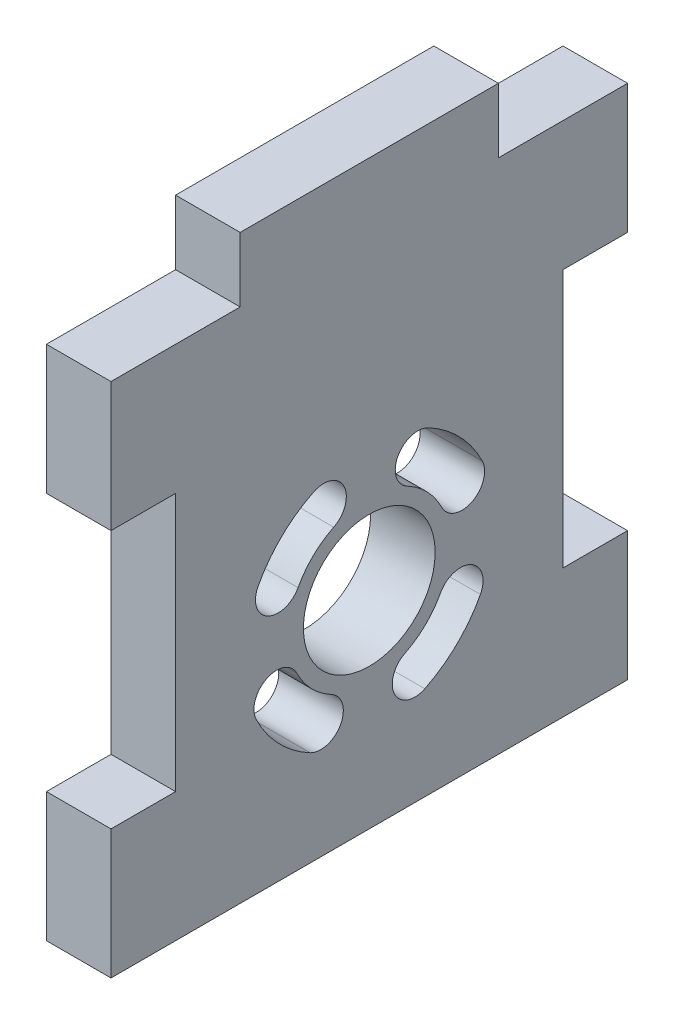
ISO-10303-21;
HEADER;
FILE_DESCRIPTION(('STEP AP214'),'2;1');
FILE_NAME('part.step','',(''),(''),'','','');
FILE_SCHEMA(('AUTOMOTIVE_DESIGN { 1 0 10303 214 1 1 1 1 }'));
ENDSEC;
DATA;
#1=APPLICATION_CONTEXT('core data for automotive mechanical design processes');
#2=APPLICATION_PROTOCOL_DEFINITION('international standard','automotive_design',2000,#1);
#3=PRODUCT_CONTEXT('',#1,'mechanical');
#4=PRODUCT('Part','Part','',(#3));
#5=PRODUCT_RELATED_PRODUCT_CATEGORY('part','',(#4));
#6=PRODUCT_DEFINITION_FORMATION('','',#4);
#7=PRODUCT_DEFINITION_CONTEXT('part definition',#1,'design');
#8=PRODUCT_DEFINITION('design','',#6,#7);
#9=PRODUCT_DEFINITION_SHAPE('','',#8);
#10=(LENGTH_UNIT() NAMED_UNIT(*) SI_UNIT(.MILLI.,.METRE.));
#11=(NAMED_UNIT(*) PLANE_ANGLE_UNIT() SI_UNIT($,.RADIAN.));
#12=(NAMED_UNIT(*) SI_UNIT($,.STERADIAN.) SOLID_ANGLE_UNIT());
#13=UNCERTAINTY_MEASURE_WITH_UNIT(LENGTH_MEASURE(1.E-05),#10,'distance_accuracy_value','');
#14=(GEOMETRIC_REPRESENTATION_CONTEXT(3) GLOBAL_UNCERTAINTY_ASSIGNED_CONTEXT((#13)) GLOBAL_UNIT_ASSIGNED_CONTEXT((#10,
#11,#12)) REPRESENTATION_CONTEXT('',''));
#15=CARTESIAN_POINT('',(0.,0.,0.));
#16=DIRECTION('',(0.,0.,1.));
#17=DIRECTION('',(1.,0.,0.));
#18=AXIS2_PLACEMENT_3D('',#15,#16,#17);
#19=CARTESIAN_POINT('',(5.,0.,0.));
#20=DIRECTION('',(1.,0.,0.));
#21=DIRECTION('',(0.,0.,-1.));
#22=AXIS2_PLACEMENT_3D('',#19,#20,#21);
#23=PLANE('',#22);
#24=DIRECTION('',(0.,1.,0.));
#25=VECTOR('',#24,1.);
#26=CARTESIAN_POINT('',(5.,0.,0.));
#27=LINE('',#26,#25);
#28=CARTESIAN_POINT('',(5.,0.,0.));
#29=VERTEX_POINT('',#28);
#30=CARTESIAN_POINT('',(5.,10.,0.));
#31=VERTEX_POINT('',#30);
#32=EDGE_CURVE('E378',#29,#31,#27,.T.);
#33=ORIENTED_EDGE('',*,*,#32,.T.);
#34=DIRECTION('',(0.,0.,1.));
#35=VECTOR('',#34,1.);
#36=CARTESIAN_POINT('',(5.,10.,0.));
#37=LINE('',#36,#35);
#38=CARTESIAN_POINT('',(5.,10.,5.));
#39=VERTEX_POINT('',#38);
#40=EDGE_CURVE('E381',#31,#39,#37,.T.);
#41=ORIENTED_EDGE('',*,*,#40,.T.);
#42=DIRECTION('',(0.,1.,0.));
#43=VECTOR('',#42,1.);
#44=CARTESIAN_POINT('',(5.,30.,5.));
#45=LINE('',#44,#43);
#46=CARTESIAN_POINT('',(5.,30.,5.));
#47=VERTEX_POINT('',#46);
#48=EDGE_CURVE('E384',#39,#47,#45,.T.);
#49=ORIENTED_EDGE('',*,*,#48,.T.);
#50=DIRECTION('',(0.,0.,-1.));
#51=VECTOR('',#50,1.);
#52=CARTESIAN_POINT('',(5.,30.,0.));
#53=LINE('',#52,#51);
#54=CARTESIAN_POINT('',(5.,30.,0.));
#55=VERTEX_POINT('',#54);
#56=EDGE_CURVE('E386',#47,#55,#53,.T.);
#57=ORIENTED_EDGE('',*,*,#56,.T.);
#58=DIRECTION('',(0.,1.,0.));
#59=VECTOR('',#58,1.);
#60=CARTESIAN_POINT('',(5.,30.,0.));
#61=LINE('',#60,#59);
#62=CARTESIAN_POINT('',(5.,40.,0.));
#63=VERTEX_POINT('',#62);
#64=EDGE_CURVE('E388',#55,#63,#61,.T.);
#65=ORIENTED_EDGE('',*,*,#64,.T.);
#66=DIRECTION('',(0.,0.,1.));
#67=VECTOR('',#66,1.);
#68=CARTESIAN_POINT('',(5.,40.,0.));
#69=LINE('',#68,#67);
#70=CARTESIAN_POINT('',(5.,40.,10.));
#71=VERTEX_POINT('',#70);
#72=EDGE_CURVE('E390',#63,#71,#69,.T.);
#73=ORIENTED_EDGE('',*,*,#72,.T.);
#74=DIRECTION('',(0.,1.,0.));
#75=VECTOR('',#74,1.);
#76=CARTESIAN_POINT('',(5.,40.,10.));
#77=LINE('',#76,#75);
#78=CARTESIAN_POINT('',(5.,45.,10.));
#79=VERTEX_POINT('',#78);
#80=EDGE_CURVE('E392',#71,#79,#77,.T.);
#81=ORIENTED_EDGE('',*,*,#80,.T.);
#82=DIRECTION('',(0.,0.,1.));
#83=VECTOR('',#82,1.);
#84=CARTESIAN_POINT('',(5.,45.,30.));
#85=LINE('',#84,#83);
#86=CARTESIAN_POINT('',(5.,45.,30.));
#87=VERTEX_POINT('',#86);
#88=EDGE_CURVE('E394',#79,#87,#85,.T.);
#89=ORIENTED_EDGE('',*,*,#88,.T.);
#90=DIRECTION('',(0.,-1.,0.));
#91=VECTOR('',#90,1.);
#92=CARTESIAN_POINT('',(5.,40.,30.));
#93=LINE('',#92,#91);
#94=CARTESIAN_POINT('',(5.,40.,30.));
#95=VERTEX_POINT('',#94);
#96=EDGE_CURVE('E396',#87,#95,#93,.T.);
#97=ORIENTED_EDGE('',*,*,#96,.T.);
#98=DIRECTION('',(0.,0.,1.));
#99=VECTOR('',#98,1.);
#100=CARTESIAN_POINT('',(5.,40.,30.));
#101=LINE('',#100,#99);
#102=CARTESIAN_POINT('',(5.,40.,40.));
#103=VERTEX_POINT('',#102);
#104=EDGE_CURVE('E398',#95,#103,#101,.T.);
#105=ORIENTED_EDGE('',*,*,#104,.T.);
#106=DIRECTION('',(0.,-1.,0.));
#107=VECTOR('',#106,1.);
#108=CARTESIAN_POINT('',(5.,30.,40.));
#109=LINE('',#108,#107);
#110=CARTESIAN_POINT('',(5.,30.,40.));
#111=VERTEX_POINT('',#110);
#112=EDGE_CURVE('E400',#103,#111,#109,.T.);
#113=ORIENTED_EDGE('',*,*,#112,.T.);
#114=DIRECTION('',(0.,0.,-1.));
#115=VECTOR('',#114,1.);
#116=CARTESIAN_POINT('',(5.,30.,40.));
#117=LINE('',#116,#115);
#118=CARTESIAN_POINT('',(5.,30.,35.));
#119=VERTEX_POINT('',#118);
#120=EDGE_CURVE('E402',#111,#119,#117,.T.);
#121=ORIENTED_EDGE('',*,*,#120,.T.);
#122=DIRECTION('',(0.,-1.,0.));
#123=VECTOR('',#122,1.);
#124=CARTESIAN_POINT('',(5.,30.,35.));
#125=LINE('',#124,#123);
#126=CARTESIAN_POINT('',(5.,9.99999999999999,35.));
#127=VERTEX_POINT('',#126);
#128=EDGE_CURVE('E404',#119,#127,#125,.T.);
#129=ORIENTED_EDGE('',*,*,#128,.T.);
#130=DIRECTION('',(0.,0.,1.));
#131=VECTOR('',#130,1.);
#132=CARTESIAN_POINT('',(5.,9.99999999999999,40.));
#133=LINE('',#132,#131);
#134=CARTESIAN_POINT('',(5.,9.99999999999999,40.));
#135=VERTEX_POINT('',#134);
#136=EDGE_CURVE('E406',#127,#135,#133,.T.);
#137=ORIENTED_EDGE('',*,*,#136,.T.);
#138=DIRECTION('',(0.,-1.,0.));
#139=VECTOR('',#138,1.);
#140=CARTESIAN_POINT('',(5.,0.,40.));
#141=LINE('',#140,#139);
#142=CARTESIAN_POINT('',(5.,0.,40.));
#143=VERTEX_POINT('',#142);
#144=EDGE_CURVE('E408',#135,#143,#141,.T.);
#145=ORIENTED_EDGE('',*,*,#144,.T.);
#146=DIRECTION('',(0.,0.,-1.));
#147=VECTOR('',#146,1.);
#148=CARTESIAN_POINT('',(5.,0.,0.));
#149=LINE('',#148,#147);
#150=EDGE_CURVE('E410',#143,#29,#149,.T.);
#151=ORIENTED_EDGE('',*,*,#150,.T.);
#152=EDGE_LOOP('',(#33,#41,#49,#57,#65,#73,#81,#89,#97,#105,#113,#121,#129,#137,#145,#151));
#153=FACE_BOUND('',#152,.T.);
#154=CARTESIAN_POINT('',(5.,16.,20.));
#155=DIRECTION('',(1.,0.,0.));
#156=DIRECTION('',(0.,0.,-1.));
#157=AXIS2_PLACEMENT_3D('',#154,#155,#156);
#158=CIRCLE('',#157,5.1);
#159=CARTESIAN_POINT('',(5.,16.,14.9));
#160=VERTEX_POINT('',#159);
#161=EDGE_CURVE('E372',#160,#160,#158,.T.);
#162=ORIENTED_EDGE('',*,*,#161,.F.);
#163=EDGE_LOOP('',(#162));
#164=FACE_BOUND('',#163,.T.);
#165=CARTESIAN_POINT('',(5.,16.,20.));
#166=DIRECTION('',(1.,0.,0.));
#167=DIRECTION('',(0.,0.,-1.));
#168=AXIS2_PLACEMENT_3D('',#165,#166,#167);
#169=CIRCLE('',#168,9.75);
#170=CARTESIAN_POINT('',(5.,24.7512638042438,24.2985906793428));
#171=VERTEX_POINT('',#170);
#172=CARTESIAN_POINT('',(5.,20.5818585103318,28.6063390934415));
#173=VERTEX_POINT('',#172);
#174=EDGE_CURVE('E343',#171,#173,#169,.T.);
#175=ORIENTED_EDGE('',*,*,#174,.F.);
#176=CARTESIAN_POINT('',(5.,23.1805241470718,23.5270487625377));
#177=DIRECTION('',(1.,0.,0.));
#178=DIRECTION('',(0.,0.,-1.));
#179=AXIS2_PLACEMENT_3D('',#176,#177,#178);
#180=CIRCLE('',#179,1.75);
#181=CARTESIAN_POINT('',(5.,21.6097844898999,22.7555068457326));
#182=VERTEX_POINT('',#181);
#183=EDGE_CURVE('E341',#182,#171,#180,.T.);
#184=ORIENTED_EDGE('',*,*,#183,.F.);
#185=CARTESIAN_POINT('',(5.,16.,20.));
#186=DIRECTION('',(-1.,0.,0.));
#187=DIRECTION('',(0.,0.,-1.));
#188=AXIS2_PLACEMENT_3D('',#185,#186,#187);
#189=CIRCLE('',#188,6.25);
#190=CARTESIAN_POINT('',(5.,18.9370887886742,25.5168840342574));
#191=VERTEX_POINT('',#190);
#192=EDGE_CURVE('E349',#191,#182,#189,.T.);
#193=ORIENTED_EDGE('',*,*,#192,.F.);
#194=CARTESIAN_POINT('',(5.,19.759473649503,27.0616115638495));
#195=DIRECTION('',(1.,0.,0.));
#196=DIRECTION('',(0.,0.,-1.));
#197=AXIS2_PLACEMENT_3D('',#194,#195,#196);
#198=CIRCLE('',#197,1.75);
#199=EDGE_CURVE('E346',#173,#191,#198,.T.);
#200=ORIENTED_EDGE('',*,*,#199,.F.);
#201=EDGE_LOOP('',(#175,#184,#193,#200));
#202=FACE_BOUND('',#201,.T.);
#203=CARTESIAN_POINT('',(5.,16.,20.));
#204=DIRECTION('',(1.,0.,0.));
#205=DIRECTION('',(0.,0.,-1.));
#206=AXIS2_PLACEMENT_3D('',#203,#204,#205);
#207=CIRCLE('',#206,9.74999999999999);
#208=CARTESIAN_POINT('',(5.,20.2985906793428,11.2487361957562));
#209=VERTEX_POINT('',#208);
#210=CARTESIAN_POINT('',(5.,24.6063390934415,15.4181414896682));
#211=VERTEX_POINT('',#210);
#212=EDGE_CURVE('E312',#209,#211,#207,.T.);
#213=ORIENTED_EDGE('',*,*,#212,.F.);
#214=CARTESIAN_POINT('',(5.,19.5270487625377,12.8194758529282));
#215=DIRECTION('',(1.,0.,0.));
#216=DIRECTION('',(0.,0.,-1.));
#217=AXIS2_PLACEMENT_3D('',#214,#215,#216);
#218=CIRCLE('',#217,1.75);
#219=CARTESIAN_POINT('',(5.,18.7555068457326,14.3902155101001));
#220=VERTEX_POINT('',#219);
#221=EDGE_CURVE('E310',#220,#209,#218,.T.);
#222=ORIENTED_EDGE('',*,*,#221,.F.);
#223=CARTESIAN_POINT('',(5.,16.,20.));
#224=DIRECTION('',(-1.,0.,0.));
#225=DIRECTION('',(0.,0.,-1.));
#226=AXIS2_PLACEMENT_3D('',#223,#224,#225);
#227=CIRCLE('',#226,6.25);
#228=CARTESIAN_POINT('',(5.,21.5168840342574,17.0629112113258));
#229=VERTEX_POINT('',#228);
#230=EDGE_CURVE('E318',#229,#220,#227,.T.);
#231=ORIENTED_EDGE('',*,*,#230,.F.);
#232=CARTESIAN_POINT('',(5.,23.0616115638495,16.240526350497));
#233=DIRECTION('',(1.,0.,0.));
#234=DIRECTION('',(0.,0.,-1.));
#235=AXIS2_PLACEMENT_3D('',#232,#233,#234);
#236=CIRCLE('',#235,1.74999999999999);
#237=EDGE_CURVE('E315',#211,#229,#236,.T.);
#238=ORIENTED_EDGE('',*,*,#237,.F.);
#239=EDGE_LOOP('',(#213,#222,#231,#238));
#240=FACE_BOUND('',#239,.T.);
#241=CARTESIAN_POINT('',(5.,16.,20.));
#242=DIRECTION('',(1.,0.,0.));
#243=DIRECTION('',(0.,0.,-1.));
#244=AXIS2_PLACEMENT_3D('',#241,#242,#243);
#245=CIRCLE('',#244,9.74999999999999);
#246=CARTESIAN_POINT('',(5.,7.24873619575623,15.7014093206572));
#247=VERTEX_POINT('',#246);
#248=CARTESIAN_POINT('',(5.,11.4181414896682,11.3936609065585));
#249=VERTEX_POINT('',#248);
#250=EDGE_CURVE('E281',#247,#249,#245,.T.);
#251=ORIENTED_EDGE('',*,*,#250,.F.);
#252=CARTESIAN_POINT('',(5.,8.81947585292819,16.4729512374623));
#253=DIRECTION('',(1.,0.,0.));
#254=DIRECTION('',(0.,0.,-1.));
#255=AXIS2_PLACEMENT_3D('',#252,#253,#254);
#256=CIRCLE('',#255,1.75);
#257=CARTESIAN_POINT('',(5.,10.3902155101001,17.2444931542674));
#258=VERTEX_POINT('',#257);
#259=EDGE_CURVE('E279',#258,#247,#256,.T.);
#260=ORIENTED_EDGE('',*,*,#259,.F.);
#261=CARTESIAN_POINT('',(5.,16.,20.));
#262=DIRECTION('',(-1.,0.,0.));
#263=DIRECTION('',(0.,0.,-1.));
#264=AXIS2_PLACEMENT_3D('',#261,#262,#263);
#265=CIRCLE('',#264,6.25);
#266=CARTESIAN_POINT('',(5.,13.0629112113258,14.4831159657426));
#267=VERTEX_POINT('',#266);
#268=EDGE_CURVE('E287',#267,#258,#265,.T.);
#269=ORIENTED_EDGE('',*,*,#268,.F.);
#270=CARTESIAN_POINT('',(5.,12.240526350497,12.9383884361505));
#271=DIRECTION('',(1.,0.,0.));
#272=DIRECTION('',(0.,0.,-1.));
#273=AXIS2_PLACEMENT_3D('',#270,#271,#272);
#274=CIRCLE('',#273,1.75);
#275=EDGE_CURVE('E284',#249,#267,#274,.T.);
#276=ORIENTED_EDGE('',*,*,#275,.F.);
#277=EDGE_LOOP('',(#251,#260,#269,#276));
#278=FACE_BOUND('',#277,.T.);
#279=CARTESIAN_POINT('',(5.,16.,20.));
#280=DIRECTION('',(1.,0.,0.));
#281=DIRECTION('',(0.,0.,-1.));
#282=AXIS2_PLACEMENT_3D('',#279,#280,#281);
#283=CIRCLE('',#282,9.75);
#284=CARTESIAN_POINT('',(5.,11.7014093206572,28.7512638042438));
#285=VERTEX_POINT('',#284);
#286=CARTESIAN_POINT('',(5.,7.39366090655847,24.5818585103318));
#287=VERTEX_POINT('',#286);
#288=EDGE_CURVE('E251',#285,#287,#283,.T.);
#289=ORIENTED_EDGE('',*,*,#288,.F.);
#290=CARTESIAN_POINT('',(5.,12.4729512374623,27.1805241470718));
#291=DIRECTION('',(1.,0.,0.));
#292=DIRECTION('',(0.,0.,-1.));
#293=AXIS2_PLACEMENT_3D('',#290,#291,#292);
#294=CIRCLE('',#293,1.75);
#295=CARTESIAN_POINT('',(5.,13.2444931542674,25.6097844898999));
#296=VERTEX_POINT('',#295);
#297=EDGE_CURVE('E243',#296,#285,#294,.T.);
#298=ORIENTED_EDGE('',*,*,#297,.F.);
#299=CARTESIAN_POINT('',(5.,16.,20.));
#300=DIRECTION('',(-1.,0.,0.));
#301=DIRECTION('',(0.,0.,-1.));
#302=AXIS2_PLACEMENT_3D('',#299,#300,#301);
#303=CIRCLE('',#302,6.25);
#304=CARTESIAN_POINT('',(5.,10.4831159657426,22.9370887886742));
#305=VERTEX_POINT('',#304);
#306=EDGE_CURVE('E265',#305,#296,#303,.T.);
#307=ORIENTED_EDGE('',*,*,#306,.F.);
#308=CARTESIAN_POINT('',(5.,8.93838843615054,23.759473649503));
#309=DIRECTION('',(1.,0.,0.));
#310=DIRECTION('',(0.,0.,-1.));
#311=AXIS2_PLACEMENT_3D('',#308,#309,#310);
#312=CIRCLE('',#311,1.75);
#313=EDGE_CURVE('E263',#287,#305,#312,.T.);
#314=ORIENTED_EDGE('',*,*,#313,.F.);
#315=EDGE_LOOP('',(#289,#298,#307,#314));
#316=FACE_BOUND('',#315,.T.);
#317=ADVANCED_FACE('F34',(#153,#164,#202,#240,#278,#316),#23,.T.);
#318=CARTESIAN_POINT('',(0.,0.,0.));
#319=DIRECTION('',(1.,0.,0.));
#320=DIRECTION('',(0.,0.,-1.));
#321=AXIS2_PLACEMENT_3D('',#318,#319,#320);
#322=PLANE('',#321);
#323=CARTESIAN_POINT('',(0.,8.81947585292819,16.4729512374623));
#324=DIRECTION('',(1.,0.,0.));
#325=DIRECTION('',(0.,0.,-1.));
#326=AXIS2_PLACEMENT_3D('',#323,#324,#325);
#327=CIRCLE('',#326,1.75);
#328=CARTESIAN_POINT('',(0.,10.3902155101001,17.2444931542674));
#329=VERTEX_POINT('',#328);
#330=CARTESIAN_POINT('',(0.,7.24873619575623,15.7014093206572));
#331=VERTEX_POINT('',#330);
#332=EDGE_CURVE('E259',#329,#331,#327,.T.);
#333=ORIENTED_EDGE('',*,*,#332,.T.);
#334=CARTESIAN_POINT('',(0.,16.,20.));
#335=DIRECTION('',(1.,0.,0.));
#336=DIRECTION('',(0.,0.,-1.));
#337=AXIS2_PLACEMENT_3D('',#334,#335,#336);
#338=CIRCLE('',#337,9.74999999999999);
#339=CARTESIAN_POINT('',(0.,11.4181414896682,11.3936609065585));
#340=VERTEX_POINT('',#339);
#341=EDGE_CURVE('E292',#331,#340,#338,.T.);
#342=ORIENTED_EDGE('',*,*,#341,.T.);
#343=CARTESIAN_POINT('',(0.,12.240526350497,12.9383884361505));
#344=DIRECTION('',(1.,0.,0.));
#345=DIRECTION('',(0.,0.,-1.));
#346=AXIS2_PLACEMENT_3D('',#343,#344,#345);
#347=CIRCLE('',#346,1.75);
#348=CARTESIAN_POINT('',(0.,13.0629112113258,14.4831159657426));
#349=VERTEX_POINT('',#348);
#350=EDGE_CURVE('E295',#340,#349,#347,.T.);
#351=ORIENTED_EDGE('',*,*,#350,.T.);
#352=CARTESIAN_POINT('',(0.,16.,20.));
#353=DIRECTION('',(-1.,0.,0.));
#354=DIRECTION('',(0.,0.,-1.));
#355=AXIS2_PLACEMENT_3D('',#352,#353,#354);
#356=CIRCLE('',#355,6.25);
#357=EDGE_CURVE('E282',#349,#329,#356,.T.);
#358=ORIENTED_EDGE('',*,*,#357,.T.);
#359=EDGE_LOOP('',(#333,#342,#351,#358));
#360=FACE_BOUND('',#359,.T.);
#361=CARTESIAN_POINT('',(0.,23.1805241470718,23.5270487625377));
#362=DIRECTION('',(1.,0.,0.));
#363=DIRECTION('',(0.,0.,-1.));
#364=AXIS2_PLACEMENT_3D('',#361,#362,#363);
#365=CIRCLE('',#364,1.75);
#366=CARTESIAN_POINT('',(0.,21.6097844898999,22.7555068457326));
#367=VERTEX_POINT('',#366);
#368=CARTESIAN_POINT('',(0.,24.7512638042438,24.2985906793428));
#369=VERTEX_POINT('',#368);
#370=EDGE_CURVE('E340',#367,#369,#365,.T.);
#371=ORIENTED_EDGE('',*,*,#370,.T.);
#372=CARTESIAN_POINT('',(0.,16.,20.));
#373=DIRECTION('',(1.,0.,0.));
#374=DIRECTION('',(0.,0.,-1.));
#375=AXIS2_PLACEMENT_3D('',#372,#373,#374);
#376=CIRCLE('',#375,9.75);
#377=CARTESIAN_POINT('',(0.,20.5818585103318,28.6063390934415));
#378=VERTEX_POINT('',#377);
#379=EDGE_CURVE('E354',#369,#378,#376,.T.);
#380=ORIENTED_EDGE('',*,*,#379,.T.);
#381=CARTESIAN_POINT('',(0.,19.759473649503,27.0616115638495));
#382=DIRECTION('',(1.,0.,0.));
#383=DIRECTION('',(0.,0.,-1.));
#384=AXIS2_PLACEMENT_3D('',#381,#382,#383);
#385=CIRCLE('',#384,1.75);
#386=CARTESIAN_POINT('',(0.,18.9370887886742,25.5168840342574));
#387=VERTEX_POINT('',#386);
#388=EDGE_CURVE('E357',#378,#387,#385,.T.);
#389=ORIENTED_EDGE('',*,*,#388,.T.);
#390=CARTESIAN_POINT('',(0.,16.,20.));
#391=DIRECTION('',(-1.,0.,0.));
#392=DIRECTION('',(0.,0.,-1.));
#393=AXIS2_PLACEMENT_3D('',#390,#391,#392);
#394=CIRCLE('',#393,6.25);
#395=EDGE_CURVE('E344',#387,#367,#394,.T.);
#396=ORIENTED_EDGE('',*,*,#395,.T.);
#397=EDGE_LOOP('',(#371,#380,#389,#396));
#398=FACE_BOUND('',#397,.T.);
#399=DIRECTION('',(0.,1.,0.));
#400=VECTOR('',#399,1.);
#401=CARTESIAN_POINT('',(0.,0.,0.));
#402=LINE('',#401,#400);
#403=CARTESIAN_POINT('',(0.,0.,0.));
#404=VERTEX_POINT('',#403);
#405=CARTESIAN_POINT('',(0.,10.,0.));
#406=VERTEX_POINT('',#405);
#407=EDGE_CURVE('E375',#404,#406,#402,.T.);
#408=ORIENTED_EDGE('',*,*,#407,.F.);
#409=DIRECTION('',(0.,0.,-1.));
#410=VECTOR('',#409,1.);
#411=CARTESIAN_POINT('',(0.,0.,0.));
#412=LINE('',#411,#410);
#413=CARTESIAN_POINT('',(0.,0.,40.));
#414=VERTEX_POINT('',#413);
#415=EDGE_CURVE('E382',#414,#404,#412,.T.);
#416=ORIENTED_EDGE('',*,*,#415,.F.);
#417=DIRECTION('',(0.,-1.,0.));
#418=VECTOR('',#417,1.);
#419=CARTESIAN_POINT('',(0.,0.,40.));
#420=LINE('',#419,#418);
#421=CARTESIAN_POINT('',(0.,9.99999999999999,40.));
#422=VERTEX_POINT('',#421);
#423=EDGE_CURVE('E441',#422,#414,#420,.T.);
#424=ORIENTED_EDGE('',*,*,#423,.F.);
#425=DIRECTION('',(0.,0.,1.));
#426=VECTOR('',#425,1.);
#427=CARTESIAN_POINT('',(0.,9.99999999999999,40.));
#428=LINE('',#427,#426);
#429=CARTESIAN_POINT('',(0.,9.99999999999999,35.));
#430=VERTEX_POINT('',#429);
#431=EDGE_CURVE('E439',#430,#422,#428,.T.);
#432=ORIENTED_EDGE('',*,*,#431,.F.);
#433=DIRECTION('',(0.,-1.,0.));
#434=VECTOR('',#433,1.);
#435=CARTESIAN_POINT('',(0.,30.,35.));
#436=LINE('',#435,#434);
#437=CARTESIAN_POINT('',(0.,30.,35.));
#438=VERTEX_POINT('',#437);
#439=EDGE_CURVE('E437',#438,#430,#436,.T.);
#440=ORIENTED_EDGE('',*,*,#439,.F.);
#441=DIRECTION('',(0.,0.,-1.));
#442=VECTOR('',#441,1.);
#443=CARTESIAN_POINT('',(0.,30.,40.));
#444=LINE('',#443,#442);
#445=CARTESIAN_POINT('',(0.,30.,40.));
#446=VERTEX_POINT('',#445);
#447=EDGE_CURVE('E435',#446,#438,#444,.T.);
#448=ORIENTED_EDGE('',*,*,#447,.F.);
#449=DIRECTION('',(0.,-1.,0.));
#450=VECTOR('',#449,1.);
#451=CARTESIAN_POINT('',(0.,30.,40.));
#452=LINE('',#451,#450);
#453=CARTESIAN_POINT('',(0.,40.,40.));
#454=VERTEX_POINT('',#453);
#455=EDGE_CURVE('E433',#454,#446,#452,.T.);
#456=ORIENTED_EDGE('',*,*,#455,.F.);
#457=DIRECTION('',(0.,0.,1.));
#458=VECTOR('',#457,1.);
#459=CARTESIAN_POINT('',(0.,40.,30.));
#460=LINE('',#459,#458);
#461=CARTESIAN_POINT('',(0.,40.,30.));
#462=VERTEX_POINT('',#461);
#463=EDGE_CURVE('E431',#462,#454,#460,.T.);
#464=ORIENTED_EDGE('',*,*,#463,.F.);
#465=DIRECTION('',(0.,-1.,0.));
#466=VECTOR('',#465,1.);
#467=CARTESIAN_POINT('',(0.,40.,30.));
#468=LINE('',#467,#466);
#469=CARTESIAN_POINT('',(0.,45.,30.));
#470=VERTEX_POINT('',#469);
#471=EDGE_CURVE('E429',#470,#462,#468,.T.);
#472=ORIENTED_EDGE('',*,*,#471,.F.);
#473=DIRECTION('',(0.,0.,1.));
#474=VECTOR('',#473,1.);
#475=CARTESIAN_POINT('',(0.,45.,30.));
#476=LINE('',#475,#474);
#477=CARTESIAN_POINT('',(0.,45.,10.));
#478=VERTEX_POINT('',#477);
#479=EDGE_CURVE('E427',#478,#470,#476,.T.);
#480=ORIENTED_EDGE('',*,*,#479,.F.);
#481=DIRECTION('',(0.,1.,0.));
#482=VECTOR('',#481,1.);
#483=CARTESIAN_POINT('',(0.,40.,10.));
#484=LINE('',#483,#482);
#485=CARTESIAN_POINT('',(0.,40.,10.));
#486=VERTEX_POINT('',#485);
#487=EDGE_CURVE('E425',#486,#478,#484,.T.);
#488=ORIENTED_EDGE('',*,*,#487,.F.);
#489=DIRECTION('',(0.,0.,1.));
#490=VECTOR('',#489,1.);
#491=CARTESIAN_POINT('',(0.,40.,0.));
#492=LINE('',#491,#490);
#493=CARTESIAN_POINT('',(0.,40.,0.));
#494=VERTEX_POINT('',#493);
#495=EDGE_CURVE('E423',#494,#486,#492,.T.);
#496=ORIENTED_EDGE('',*,*,#495,.F.);
#497=DIRECTION('',(0.,1.,0.));
#498=VECTOR('',#497,1.);
#499=CARTESIAN_POINT('',(0.,30.,0.));
#500=LINE('',#499,#498);
#501=CARTESIAN_POINT('',(0.,30.,0.));
#502=VERTEX_POINT('',#501);
#503=EDGE_CURVE('E421',#502,#494,#500,.T.);
#504=ORIENTED_EDGE('',*,*,#503,.F.);
#505=DIRECTION('',(0.,0.,-1.));
#506=VECTOR('',#505,1.);
#507=CARTESIAN_POINT('',(0.,30.,0.));
#508=LINE('',#507,#506);
#509=CARTESIAN_POINT('',(0.,30.,5.));
#510=VERTEX_POINT('',#509);
#511=EDGE_CURVE('E419',#510,#502,#508,.T.);
#512=ORIENTED_EDGE('',*,*,#511,.F.);
#513=DIRECTION('',(0.,1.,0.));
#514=VECTOR('',#513,1.);
#515=CARTESIAN_POINT('',(0.,30.,5.));
#516=LINE('',#515,#514);
#517=CARTESIAN_POINT('',(0.,10.,5.));
#518=VERTEX_POINT('',#517);
#519=EDGE_CURVE('E417',#518,#510,#516,.T.);
#520=ORIENTED_EDGE('',*,*,#519,.F.);
#521=DIRECTION('',(0.,0.,1.));
#522=VECTOR('',#521,1.);
#523=CARTESIAN_POINT('',(0.,10.,0.));
#524=LINE('',#523,#522);
#525=EDGE_CURVE('E415',#406,#518,#524,.T.);
#526=ORIENTED_EDGE('',*,*,#525,.F.);
#527=EDGE_LOOP('',(#408,#416,#424,#432,#440,#448,#456,#464,#472,#480,#488,#496,#504,#512,#520,#526));
#528=FACE_BOUND('',#527,.T.);
#529=CARTESIAN_POINT('',(0.,16.,20.));
#530=DIRECTION('',(1.,0.,0.));
#531=DIRECTION('',(0.,0.,-1.));
#532=AXIS2_PLACEMENT_3D('',#529,#530,#531);
#533=CIRCLE('',#532,5.1);
#534=CARTESIAN_POINT('',(0.,16.,14.9));
#535=VERTEX_POINT('',#534);
#536=EDGE_CURVE('E371',#535,#535,#533,.T.);
#537=ORIENTED_EDGE('',*,*,#536,.T.);
#538=EDGE_LOOP('',(#537));
#539=FACE_BOUND('',#538,.T.);
#540=CARTESIAN_POINT('',(0.,19.5270487625377,12.8194758529282));
#541=DIRECTION('',(1.,0.,0.));
#542=DIRECTION('',(0.,0.,-1.));
#543=AXIS2_PLACEMENT_3D('',#540,#541,#542);
#544=CIRCLE('',#543,1.75);
#545=CARTESIAN_POINT('',(0.,18.7555068457326,14.3902155101001));
#546=VERTEX_POINT('',#545);
#547=CARTESIAN_POINT('',(0.,20.2985906793428,11.2487361957562));
#548=VERTEX_POINT('',#547);
#549=EDGE_CURVE('E309',#546,#548,#544,.T.);
#550=ORIENTED_EDGE('',*,*,#549,.T.);
#551=CARTESIAN_POINT('',(0.,16.,20.));
#552=DIRECTION('',(1.,0.,0.));
#553=DIRECTION('',(0.,0.,-1.));
#554=AXIS2_PLACEMENT_3D('',#551,#552,#553);
#555=CIRCLE('',#554,9.74999999999999);
#556=CARTESIAN_POINT('',(0.,24.6063390934415,15.4181414896682));
#557=VERTEX_POINT('',#556);
#558=EDGE_CURVE('E323',#548,#557,#555,.T.);
#559=ORIENTED_EDGE('',*,*,#558,.T.);
#560=CARTESIAN_POINT('',(0.,23.0616115638495,16.240526350497));
#561=DIRECTION('',(1.,0.,0.));
#562=DIRECTION('',(0.,0.,-1.));
#563=AXIS2_PLACEMENT_3D('',#560,#561,#562);
#564=CIRCLE('',#563,1.74999999999999);
#565=CARTESIAN_POINT('',(0.,21.5168840342574,17.0629112113258));
#566=VERTEX_POINT('',#565);
#567=EDGE_CURVE('E326',#557,#566,#564,.T.);
#568=ORIENTED_EDGE('',*,*,#567,.T.);
#569=CARTESIAN_POINT('',(0.,16.,20.));
#570=DIRECTION('',(-1.,0.,0.));
#571=DIRECTION('',(0.,0.,-1.));
#572=AXIS2_PLACEMENT_3D('',#569,#570,#571);
#573=CIRCLE('',#572,6.25);
#574=EDGE_CURVE('E313',#566,#546,#573,.T.);
#575=ORIENTED_EDGE('',*,*,#574,.T.);
#576=EDGE_LOOP('',(#550,#559,#568,#575));
#577=FACE_BOUND('',#576,.T.);
#578=CARTESIAN_POINT('',(0.,12.4729512374623,27.1805241470718));
#579=DIRECTION('',(1.,0.,0.));
#580=DIRECTION('',(0.,0.,-1.));
#581=AXIS2_PLACEMENT_3D('',#578,#579,#580);
#582=CIRCLE('',#581,1.75);
#583=CARTESIAN_POINT('',(0.,13.2444931542674,25.6097844898999));
#584=VERTEX_POINT('',#583);
#585=CARTESIAN_POINT('',(0.,11.7014093206572,28.7512638042438));
#586=VERTEX_POINT('',#585);
#587=EDGE_CURVE('E57',#584,#586,#582,.T.);
#588=ORIENTED_EDGE('',*,*,#587,.T.);
#589=CARTESIAN_POINT('',(0.,16.,20.));
#590=DIRECTION('',(1.,0.,0.));
#591=DIRECTION('',(0.,0.,-1.));
#592=AXIS2_PLACEMENT_3D('',#589,#590,#591);
#593=CIRCLE('',#592,9.75);
#594=CARTESIAN_POINT('',(0.,7.39366090655847,24.5818585103318));
#595=VERTEX_POINT('',#594);
#596=EDGE_CURVE('E258',#586,#595,#593,.T.);
#597=ORIENTED_EDGE('',*,*,#596,.T.);
#598=CARTESIAN_POINT('',(0.,8.93838843615054,23.759473649503));
#599=DIRECTION('',(1.,0.,0.));
#600=DIRECTION('',(0.,0.,-1.));
#601=AXIS2_PLACEMENT_3D('',#598,#599,#600);
#602=CIRCLE('',#601,1.75);
#603=CARTESIAN_POINT('',(0.,10.4831159657426,22.9370887886742));
#604=VERTEX_POINT('',#603);
#605=EDGE_CURVE('E271',#595,#604,#602,.T.);
#606=ORIENTED_EDGE('',*,*,#605,.T.);
#607=CARTESIAN_POINT('',(0.,16.,20.));
#608=DIRECTION('',(-1.,0.,0.));
#609=DIRECTION('',(0.,0.,-1.));
#610=AXIS2_PLACEMENT_3D('',#607,#608,#609);
#611=CIRCLE('',#610,6.25);
#612=EDGE_CURVE('E252',#604,#584,#611,.T.);
#613=ORIENTED_EDGE('',*,*,#612,.T.);
#614=EDGE_LOOP('',(#588,#597,#606,#613));
#615=FACE_BOUND('',#614,.T.);
#616=ADVANCED_FACE('F495',(#360,#398,#528,#539,#577,#615),#322,.F.);
#617=CARTESIAN_POINT('',(5.,0.,0.));
#618=DIRECTION('',(0.,0.,1.));
#619=DIRECTION('',(1.,0.,0.));
#620=AXIS2_PLACEMENT_3D('',#617,#618,#619);
#621=PLANE('',#620);
#622=ORIENTED_EDGE('',*,*,#407,.T.);
#623=DIRECTION('',(-1.,0.,0.));
#624=VECTOR('',#623,1.);
#625=CARTESIAN_POINT('',(5.,10.,0.));
#626=LINE('',#625,#624);
#627=EDGE_CURVE('E11',#31,#406,#626,.T.);
#628=ORIENTED_EDGE('',*,*,#627,.F.);
#629=ORIENTED_EDGE('',*,*,#32,.F.);
#630=DIRECTION('',(-1.,0.,0.));
#631=VECTOR('',#630,1.);
#632=CARTESIAN_POINT('',(5.,0.,0.));
#633=LINE('',#632,#631);
#634=EDGE_CURVE('E412',#29,#404,#633,.T.);
#635=ORIENTED_EDGE('',*,*,#634,.T.);
#636=EDGE_LOOP('',(#622,#628,#629,#635));
#637=FACE_BOUND('',#636,.T.);
#638=ADVANCED_FACE('F36',(#637),#621,.F.);
#639=CARTESIAN_POINT('',(5.,10.,0.));
#640=DIRECTION('',(0.,-1.,0.));
#641=DIRECTION('',(0.,0.,-1.));
#642=AXIS2_PLACEMENT_3D('',#639,#640,#641);
#643=PLANE('',#642);
#644=ORIENTED_EDGE('',*,*,#525,.T.);
#645=DIRECTION('',(-1.,0.,0.));
#646=VECTOR('',#645,1.);
#647=CARTESIAN_POINT('',(5.,10.,5.));
#648=LINE('',#647,#646);
#649=EDGE_CURVE('E42',#39,#518,#648,.T.);
#650=ORIENTED_EDGE('',*,*,#649,.F.);
#651=ORIENTED_EDGE('',*,*,#40,.F.);
#652=ORIENTED_EDGE('',*,*,#627,.T.);
#653=EDGE_LOOP('',(#644,#650,#651,#652));
#654=FACE_BOUND('',#653,.T.);
#655=ADVANCED_FACE('F513',(#654),#643,.F.);
#656=CARTESIAN_POINT('',(5.,30.,5.));
#657=DIRECTION('',(0.,0.,1.));
#658=DIRECTION('',(0.,-1.,0.));
#659=AXIS2_PLACEMENT_3D('',#656,#657,#658);
#660=PLANE('',#659);
#661=ORIENTED_EDGE('',*,*,#519,.T.);
#662=DIRECTION('',(-1.,0.,0.));
#663=VECTOR('',#662,1.);
#664=CARTESIAN_POINT('',(5.,30.,5.));
#665=LINE('',#664,#663);
#666=EDGE_CURVE('E482',#47,#510,#665,.T.);
#667=ORIENTED_EDGE('',*,*,#666,.F.);
#668=ORIENTED_EDGE('',*,*,#48,.F.);
#669=ORIENTED_EDGE('',*,*,#649,.T.);
#670=EDGE_LOOP('',(#661,#667,#668,#669));
#671=FACE_BOUND('',#670,.T.);
#672=ADVANCED_FACE('F489',(#671),#660,.F.);
#673=CARTESIAN_POINT('',(5.,30.,0.));
#674=DIRECTION('',(0.,1.,0.));
#675=DIRECTION('',(0.,0.,1.));
#676=AXIS2_PLACEMENT_3D('',#673,#674,#675);
#677=PLANE('',#676);
#678=ORIENTED_EDGE('',*,*,#511,.T.);
#679=DIRECTION('',(-1.,0.,0.));
#680=VECTOR('',#679,1.);
#681=CARTESIAN_POINT('',(5.,30.,0.));
#682=LINE('',#681,#680);
#683=EDGE_CURVE('E479',#55,#502,#682,.T.);
#684=ORIENTED_EDGE('',*,*,#683,.F.);
#685=ORIENTED_EDGE('',*,*,#56,.F.);
#686=ORIENTED_EDGE('',*,*,#666,.T.);
#687=EDGE_LOOP('',(#678,#684,#685,#686));
#688=FACE_BOUND('',#687,.T.);
#689=ADVANCED_FACE('F501',(#688),#677,.F.);
#690=CARTESIAN_POINT('',(5.,30.,0.));
#691=DIRECTION('',(0.,0.,1.));
#692=DIRECTION('',(1.,0.,0.));
#693=AXIS2_PLACEMENT_3D('',#690,#691,#692);
#694=PLANE('',#693);
#695=ORIENTED_EDGE('',*,*,#503,.T.);
#696=DIRECTION('',(-1.,0.,0.));
#697=VECTOR('',#696,1.);
#698=CARTESIAN_POINT('',(5.,40.,0.));
#699=LINE('',#698,#697);
#700=EDGE_CURVE('E476',#63,#494,#699,.T.);
#701=ORIENTED_EDGE('',*,*,#700,.F.);
#702=ORIENTED_EDGE('',*,*,#64,.F.);
#703=ORIENTED_EDGE('',*,*,#683,.T.);
#704=EDGE_LOOP('',(#695,#701,#702,#703));
#705=FACE_BOUND('',#704,.T.);
#706=ADVANCED_FACE('F505',(#705),#694,.F.);
#707=CARTESIAN_POINT('',(5.,40.,0.));
#708=DIRECTION('',(0.,-1.,0.));
#709=DIRECTION('',(0.,0.,-1.));
#710=AXIS2_PLACEMENT_3D('',#707,#708,#709);
#711=PLANE('',#710);
#712=ORIENTED_EDGE('',*,*,#495,.T.);
#713=DIRECTION('',(-1.,0.,0.));
#714=VECTOR('',#713,1.);
#715=CARTESIAN_POINT('',(5.,40.,10.));
#716=LINE('',#715,#714);
#717=EDGE_CURVE('E473',#71,#486,#716,.T.);
#718=ORIENTED_EDGE('',*,*,#717,.F.);
#719=ORIENTED_EDGE('',*,*,#72,.F.);
#720=ORIENTED_EDGE('',*,*,#700,.T.);
#721=EDGE_LOOP('',(#712,#718,#719,#720));
#722=FACE_BOUND('',#721,.T.);
#723=ADVANCED_FACE('F566',(#722),#711,.F.);
#724=CARTESIAN_POINT('',(5.,40.,10.));
#725=DIRECTION('',(0.,0.,1.));
#726=DIRECTION('',(1.,0.,0.));
#727=AXIS2_PLACEMENT_3D('',#724,#725,#726);
#728=PLANE('',#727);
#729=ORIENTED_EDGE('',*,*,#487,.T.);
#730=DIRECTION('',(-1.,0.,0.));
#731=VECTOR('',#730,1.);
#732=CARTESIAN_POINT('',(5.,45.,10.));
#733=LINE('',#732,#731);
#734=EDGE_CURVE('E470',#79,#478,#733,.T.);
#735=ORIENTED_EDGE('',*,*,#734,.F.);
#736=ORIENTED_EDGE('',*,*,#80,.F.);
#737=ORIENTED_EDGE('',*,*,#717,.T.);
#738=EDGE_LOOP('',(#729,#735,#736,#737));
#739=FACE_BOUND('',#738,.T.);
#740=ADVANCED_FACE('F563',(#739),#728,.F.);
#741=CARTESIAN_POINT('',(5.,45.,30.));
#742=DIRECTION('',(0.,-1.,0.));
#743=DIRECTION('',(0.,0.,-1.));
#744=AXIS2_PLACEMENT_3D('',#741,#742,#743);
#745=PLANE('',#744);
#746=ORIENTED_EDGE('',*,*,#479,.T.);
#747=DIRECTION('',(-1.,0.,0.));
#748=VECTOR('',#747,1.);
#749=CARTESIAN_POINT('',(5.,45.,30.));
#750=LINE('',#749,#748);
#751=EDGE_CURVE('E467',#87,#470,#750,.T.);
#752=ORIENTED_EDGE('',*,*,#751,.F.);
#753=ORIENTED_EDGE('',*,*,#88,.F.);
#754=ORIENTED_EDGE('',*,*,#734,.T.);
#755=EDGE_LOOP('',(#746,#752,#753,#754));
#756=FACE_BOUND('',#755,.T.);
#757=ADVANCED_FACE('F559',(#756),#745,.F.);
#758=CARTESIAN_POINT('',(5.,40.,30.));
#759=DIRECTION('',(0.,0.,-1.));
#760=DIRECTION('',(-1.,0.,0.));
#761=AXIS2_PLACEMENT_3D('',#758,#759,#760);
#762=PLANE('',#761);
#763=ORIENTED_EDGE('',*,*,#471,.T.);
#764=DIRECTION('',(-1.,0.,0.));
#765=VECTOR('',#764,1.);
#766=CARTESIAN_POINT('',(5.,40.,30.));
#767=LINE('',#766,#765);
#768=EDGE_CURVE('E464',#95,#462,#767,.T.);
#769=ORIENTED_EDGE('',*,*,#768,.F.);
#770=ORIENTED_EDGE('',*,*,#96,.F.);
#771=ORIENTED_EDGE('',*,*,#751,.T.);
#772=EDGE_LOOP('',(#763,#769,#770,#771));
#773=FACE_BOUND('',#772,.T.);
#774=ADVANCED_FACE('F555',(#773),#762,.F.);
#775=CARTESIAN_POINT('',(5.,40.,30.));
#776=DIRECTION('',(0.,-1.,0.));
#777=DIRECTION('',(0.,0.,-1.));
#778=AXIS2_PLACEMENT_3D('',#775,#776,#777);
#779=PLANE('',#778);
#780=ORIENTED_EDGE('',*,*,#463,.T.);
#781=DIRECTION('',(-1.,0.,0.));
#782=VECTOR('',#781,1.);
#783=CARTESIAN_POINT('',(5.,40.,40.));
#784=LINE('',#783,#782);
#785=EDGE_CURVE('E461',#103,#454,#784,.T.);
#786=ORIENTED_EDGE('',*,*,#785,.F.);
#787=ORIENTED_EDGE('',*,*,#104,.F.);
#788=ORIENTED_EDGE('',*,*,#768,.T.);
#789=EDGE_LOOP('',(#780,#786,#787,#788));
#790=FACE_BOUND('',#789,.T.);
#791=ADVANCED_FACE('F550',(#790),#779,.F.);
#792=CARTESIAN_POINT('',(5.,30.,40.));
#793=DIRECTION('',(0.,0.,-1.));
#794=DIRECTION('',(-1.,0.,0.));
#795=AXIS2_PLACEMENT_3D('',#792,#793,#794);
#796=PLANE('',#795);
#797=ORIENTED_EDGE('',*,*,#455,.T.);
#798=DIRECTION('',(-1.,0.,0.));
#799=VECTOR('',#798,1.);
#800=CARTESIAN_POINT('',(5.,30.,40.));
#801=LINE('',#800,#799);
#802=EDGE_CURVE('E458',#111,#446,#801,.T.);
#803=ORIENTED_EDGE('',*,*,#802,.F.);
#804=ORIENTED_EDGE('',*,*,#112,.F.);
#805=ORIENTED_EDGE('',*,*,#785,.T.);
#806=EDGE_LOOP('',(#797,#803,#804,#805));
#807=FACE_BOUND('',#806,.T.);
#808=ADVANCED_FACE('F544',(#807),#796,.F.);
#809=CARTESIAN_POINT('',(5.,30.,40.));
#810=DIRECTION('',(0.,1.,0.));
#811=DIRECTION('',(0.,0.,1.));
#812=AXIS2_PLACEMENT_3D('',#809,#810,#811);
#813=PLANE('',#812);
#814=ORIENTED_EDGE('',*,*,#447,.T.);
#815=DIRECTION('',(-1.,0.,0.));
#816=VECTOR('',#815,1.);
#817=CARTESIAN_POINT('',(5.,30.,35.));
#818=LINE('',#817,#816);
#819=EDGE_CURVE('E455',#119,#438,#818,.T.);
#820=ORIENTED_EDGE('',*,*,#819,.F.);
#821=ORIENTED_EDGE('',*,*,#120,.F.);
#822=ORIENTED_EDGE('',*,*,#802,.T.);
#823=EDGE_LOOP('',(#814,#820,#821,#822));
#824=FACE_BOUND('',#823,.T.);
#825=ADVANCED_FACE('F540',(#824),#813,.F.);
#826=CARTESIAN_POINT('',(5.,30.,35.));
#827=DIRECTION('',(0.,0.,-1.));
#828=DIRECTION('',(-1.,0.,0.));
#829=AXIS2_PLACEMENT_3D('',#826,#827,#828);
#830=PLANE('',#829);
#831=ORIENTED_EDGE('',*,*,#439,.T.);
#832=DIRECTION('',(-1.,0.,0.));
#833=VECTOR('',#832,1.);
#834=CARTESIAN_POINT('',(5.,9.99999999999999,35.));
#835=LINE('',#834,#833);
#836=EDGE_CURVE('E452',#127,#430,#835,.T.);
#837=ORIENTED_EDGE('',*,*,#836,.F.);
#838=ORIENTED_EDGE('',*,*,#128,.F.);
#839=ORIENTED_EDGE('',*,*,#819,.T.);
#840=EDGE_LOOP('',(#831,#837,#838,#839));
#841=FACE_BOUND('',#840,.T.);
#842=ADVANCED_FACE('F535',(#841),#830,.F.);
#843=CARTESIAN_POINT('',(5.,9.99999999999999,40.));
#844=DIRECTION('',(0.,-1.,0.));
#845=DIRECTION('',(0.,0.,-1.));
#846=AXIS2_PLACEMENT_3D('',#843,#844,#845);
#847=PLANE('',#846);
#848=ORIENTED_EDGE('',*,*,#431,.T.);
#849=DIRECTION('',(-1.,0.,0.));
#850=VECTOR('',#849,1.);
#851=CARTESIAN_POINT('',(5.,9.99999999999999,40.));
#852=LINE('',#851,#850);
#853=EDGE_CURVE('E449',#135,#422,#852,.T.);
#854=ORIENTED_EDGE('',*,*,#853,.F.);
#855=ORIENTED_EDGE('',*,*,#136,.F.);
#856=ORIENTED_EDGE('',*,*,#836,.T.);
#857=EDGE_LOOP('',(#848,#854,#855,#856));
#858=FACE_BOUND('',#857,.T.);
#859=ADVANCED_FACE('F529',(#858),#847,.F.);
#860=CARTESIAN_POINT('',(5.,0.,40.));
#861=DIRECTION('',(0.,0.,-1.));
#862=DIRECTION('',(-1.,0.,0.));
#863=AXIS2_PLACEMENT_3D('',#860,#861,#862);
#864=PLANE('',#863);
#865=ORIENTED_EDGE('',*,*,#423,.T.);
#866=DIRECTION('',(-1.,0.,0.));
#867=VECTOR('',#866,1.);
#868=CARTESIAN_POINT('',(5.,0.,40.));
#869=LINE('',#868,#867);
#870=EDGE_CURVE('E446',#143,#414,#869,.T.);
#871=ORIENTED_EDGE('',*,*,#870,.F.);
#872=ORIENTED_EDGE('',*,*,#144,.F.);
#873=ORIENTED_EDGE('',*,*,#853,.T.);
#874=EDGE_LOOP('',(#865,#871,#872,#873));
#875=FACE_BOUND('',#874,.T.);
#876=ADVANCED_FACE('F525',(#875),#864,.F.);
#877=CARTESIAN_POINT('',(5.,0.,0.));
#878=DIRECTION('',(0.,1.,0.));
#879=DIRECTION('',(0.,0.,1.));
#880=AXIS2_PLACEMENT_3D('',#877,#878,#879);
#881=PLANE('',#880);
#882=ORIENTED_EDGE('',*,*,#415,.T.);
#883=ORIENTED_EDGE('',*,*,#634,.F.);
#884=ORIENTED_EDGE('',*,*,#150,.F.);
#885=ORIENTED_EDGE('',*,*,#870,.T.);
#886=EDGE_LOOP('',(#882,#883,#884,#885));
#887=FACE_BOUND('',#886,.T.);
#888=ADVANCED_FACE('F520',(#887),#881,.F.);
#889=CARTESIAN_POINT('',(5.,16.,20.));
#890=DIRECTION('',(-1.,0.,0.));
#891=DIRECTION('',(0.,0.,1.));
#892=AXIS2_PLACEMENT_3D('',#889,#890,#891);
#893=CYLINDRICAL_SURFACE('',#892,5.1);
#894=ORIENTED_EDGE('',*,*,#161,.T.);
#895=EDGE_LOOP('',(#894));
#896=FACE_BOUND('',#895,.T.);
#897=ORIENTED_EDGE('',*,*,#536,.F.);
#898=EDGE_LOOP('',(#897));
#899=FACE_BOUND('',#898,.T.);
#900=ADVANCED_FACE('F583',(#896,#899),#893,.F.);
#901=CARTESIAN_POINT('',(5.,23.1805241470718,23.5270487625377));
#902=DIRECTION('',(-1.,0.,0.));
#903=DIRECTION('',(0.,0.,1.));
#904=AXIS2_PLACEMENT_3D('',#901,#902,#903);
#905=CYLINDRICAL_SURFACE('',#904,1.75);
#906=ORIENTED_EDGE('',*,*,#370,.F.);
#907=DIRECTION('',(-1.,0.,0.));
#908=VECTOR('',#907,1.);
#909=CARTESIAN_POINT('',(5.,21.6097844898999,22.7555068457326));
#910=LINE('',#909,#908);
#911=EDGE_CURVE('E351',#182,#367,#910,.T.);
#912=ORIENTED_EDGE('',*,*,#911,.F.);
#913=ORIENTED_EDGE('',*,*,#183,.T.);
#914=DIRECTION('',(-1.,0.,0.));
#915=VECTOR('',#914,1.);
#916=CARTESIAN_POINT('',(5.,24.7512638042438,24.2985906793428));
#917=LINE('',#916,#915);
#918=EDGE_CURVE('E368',#171,#369,#917,.T.);
#919=ORIENTED_EDGE('',*,*,#918,.T.);
#920=EDGE_LOOP('',(#906,#912,#913,#919));
#921=FACE_BOUND('',#920,.T.);
#922=ADVANCED_FACE('F645',(#921),#905,.F.);
#923=CARTESIAN_POINT('',(5.,16.,20.));
#924=DIRECTION('',(-1.,0.,0.));
#925=DIRECTION('',(0.,0.,1.));
#926=AXIS2_PLACEMENT_3D('',#923,#924,#925);
#927=CYLINDRICAL_SURFACE('',#926,9.75);
#928=ORIENTED_EDGE('',*,*,#379,.F.);
#929=ORIENTED_EDGE('',*,*,#918,.F.);
#930=ORIENTED_EDGE('',*,*,#174,.T.);
#931=DIRECTION('',(-1.,0.,0.));
#932=VECTOR('',#931,1.);
#933=CARTESIAN_POINT('',(5.,20.5818585103318,28.6063390934415));
#934=LINE('',#933,#932);
#935=EDGE_CURVE('E366',#173,#378,#934,.T.);
#936=ORIENTED_EDGE('',*,*,#935,.T.);
#937=EDGE_LOOP('',(#928,#929,#930,#936));
#938=FACE_BOUND('',#937,.T.);
#939=ADVANCED_FACE('F652',(#938),#927,.F.);
#940=CARTESIAN_POINT('',(5.,19.759473649503,27.0616115638495));
#941=DIRECTION('',(-1.,0.,0.));
#942=DIRECTION('',(0.,0.,1.));
#943=AXIS2_PLACEMENT_3D('',#940,#941,#942);
#944=CYLINDRICAL_SURFACE('',#943,1.75);
#945=ORIENTED_EDGE('',*,*,#388,.F.);
#946=ORIENTED_EDGE('',*,*,#935,.F.);
#947=ORIENTED_EDGE('',*,*,#199,.T.);
#948=DIRECTION('',(-1.,0.,0.));
#949=VECTOR('',#948,1.);
#950=CARTESIAN_POINT('',(5.,18.9370887886742,25.5168840342574));
#951=LINE('',#950,#949);
#952=EDGE_CURVE('E364',#191,#387,#951,.T.);
#953=ORIENTED_EDGE('',*,*,#952,.T.);
#954=EDGE_LOOP('',(#945,#946,#947,#953));
#955=FACE_BOUND('',#954,.T.);
#956=ADVANCED_FACE('F659',(#955),#944,.F.);
#957=CARTESIAN_POINT('',(5.,16.,20.));
#958=DIRECTION('',(-1.,0.,0.));
#959=DIRECTION('',(0.,0.,1.));
#960=AXIS2_PLACEMENT_3D('',#957,#958,#959);
#961=CYLINDRICAL_SURFACE('',#960,6.25);
#962=ORIENTED_EDGE('',*,*,#395,.F.);
#963=ORIENTED_EDGE('',*,*,#952,.F.);
#964=ORIENTED_EDGE('',*,*,#192,.T.);
#965=ORIENTED_EDGE('',*,*,#911,.T.);
#966=EDGE_LOOP('',(#962,#963,#964,#965));
#967=FACE_BOUND('',#966,.T.);
#968=ADVANCED_FACE('F667',(#967),#961,.T.);
#969=CARTESIAN_POINT('',(5.,19.5270487625377,12.8194758529282));
#970=DIRECTION('',(-1.,0.,0.));
#971=DIRECTION('',(0.,0.,1.));
#972=AXIS2_PLACEMENT_3D('',#969,#970,#971);
#973=CYLINDRICAL_SURFACE('',#972,1.75);
#974=ORIENTED_EDGE('',*,*,#549,.F.);
#975=DIRECTION('',(-1.,0.,0.));
#976=VECTOR('',#975,1.);
#977=CARTESIAN_POINT('',(5.,18.7555068457326,14.3902155101001));
#978=LINE('',#977,#976);
#979=EDGE_CURVE('E320',#220,#546,#978,.T.);
#980=ORIENTED_EDGE('',*,*,#979,.F.);
#981=ORIENTED_EDGE('',*,*,#221,.T.);
#982=DIRECTION('',(-1.,0.,0.));
#983=VECTOR('',#982,1.);
#984=CARTESIAN_POINT('',(5.,20.2985906793428,11.2487361957562));
#985=LINE('',#984,#983);
#986=EDGE_CURVE('E337',#209,#548,#985,.T.);
#987=ORIENTED_EDGE('',*,*,#986,.T.);
#988=EDGE_LOOP('',(#974,#980,#981,#987));
#989=FACE_BOUND('',#988,.T.);
#990=ADVANCED_FACE('F675',(#989),#973,.F.);
#991=CARTESIAN_POINT('',(5.,16.,20.));
#992=DIRECTION('',(-1.,0.,0.));
#993=DIRECTION('',(0.,0.,1.));
#994=AXIS2_PLACEMENT_3D('',#991,#992,#993);
#995=CYLINDRICAL_SURFACE('',#994,9.74999999999999);
#996=ORIENTED_EDGE('',*,*,#558,.F.);
#997=ORIENTED_EDGE('',*,*,#986,.F.);
#998=ORIENTED_EDGE('',*,*,#212,.T.);
#999=DIRECTION('',(-1.,0.,0.));
#1000=VECTOR('',#999,1.);
#1001=CARTESIAN_POINT('',(5.,24.6063390934415,15.4181414896682));
#1002=LINE('',#1001,#1000);
#1003=EDGE_CURVE('E335',#211,#557,#1002,.T.);
#1004=ORIENTED_EDGE('',*,*,#1003,.T.);
#1005=EDGE_LOOP('',(#996,#997,#998,#1004));
#1006=FACE_BOUND('',#1005,.T.);
#1007=ADVANCED_FACE('F683',(#1006),#995,.F.);
#1008=CARTESIAN_POINT('',(5.,23.0616115638495,16.240526350497));
#1009=DIRECTION('',(-1.,0.,0.));
#1010=DIRECTION('',(0.,0.,1.));
#1011=AXIS2_PLACEMENT_3D('',#1008,#1009,#1010);
#1012=CYLINDRICAL_SURFACE('',#1011,1.74999999999999);
#1013=ORIENTED_EDGE('',*,*,#567,.F.);
#1014=ORIENTED_EDGE('',*,*,#1003,.F.);
#1015=ORIENTED_EDGE('',*,*,#237,.T.);
#1016=DIRECTION('',(-1.,0.,0.));
#1017=VECTOR('',#1016,1.);
#1018=CARTESIAN_POINT('',(5.,21.5168840342574,17.0629112113258));
#1019=LINE('',#1018,#1017);
#1020=EDGE_CURVE('E333',#229,#566,#1019,.T.);
#1021=ORIENTED_EDGE('',*,*,#1020,.T.);
#1022=EDGE_LOOP('',(#1013,#1014,#1015,#1021));
#1023=FACE_BOUND('',#1022,.T.);
#1024=ADVANCED_FACE('F691',(#1023),#1012,.F.);
#1025=CARTESIAN_POINT('',(5.,16.,20.));
#1026=DIRECTION('',(-1.,0.,0.));
#1027=DIRECTION('',(0.,0.,1.));
#1028=AXIS2_PLACEMENT_3D('',#1025,#1026,#1027);
#1029=CYLINDRICAL_SURFACE('',#1028,6.25);
#1030=ORIENTED_EDGE('',*,*,#574,.F.);
#1031=ORIENTED_EDGE('',*,*,#1020,.F.);
#1032=ORIENTED_EDGE('',*,*,#230,.T.);
#1033=ORIENTED_EDGE('',*,*,#979,.T.);
#1034=EDGE_LOOP('',(#1030,#1031,#1032,#1033));
#1035=FACE_BOUND('',#1034,.T.);
#1036=ADVANCED_FACE('F699',(#1035),#1029,.T.);
#1037=CARTESIAN_POINT('',(5.,8.81947585292819,16.4729512374623));
#1038=DIRECTION('',(-1.,0.,0.));
#1039=DIRECTION('',(0.,0.,1.));
#1040=AXIS2_PLACEMENT_3D('',#1037,#1038,#1039);
#1041=CYLINDRICAL_SURFACE('',#1040,1.75);
#1042=ORIENTED_EDGE('',*,*,#332,.F.);
#1043=DIRECTION('',(-1.,0.,0.));
#1044=VECTOR('',#1043,1.);
#1045=CARTESIAN_POINT('',(5.,10.3902155101001,17.2444931542674));
#1046=LINE('',#1045,#1044);
#1047=EDGE_CURVE('E289',#258,#329,#1046,.T.);
#1048=ORIENTED_EDGE('',*,*,#1047,.F.);
#1049=ORIENTED_EDGE('',*,*,#259,.T.);
#1050=DIRECTION('',(-1.,0.,0.));
#1051=VECTOR('',#1050,1.);
#1052=CARTESIAN_POINT('',(5.,7.24873619575623,15.7014093206572));
#1053=LINE('',#1052,#1051);
#1054=EDGE_CURVE('E306',#247,#331,#1053,.T.);
#1055=ORIENTED_EDGE('',*,*,#1054,.T.);
#1056=EDGE_LOOP('',(#1042,#1048,#1049,#1055));
#1057=FACE_BOUND('',#1056,.T.);
#1058=ADVANCED_FACE('F707',(#1057),#1041,.F.);
#1059=CARTESIAN_POINT('',(5.,16.,20.));
#1060=DIRECTION('',(-1.,0.,0.));
#1061=DIRECTION('',(0.,0.,1.));
#1062=AXIS2_PLACEMENT_3D('',#1059,#1060,#1061);
#1063=CYLINDRICAL_SURFACE('',#1062,9.74999999999999);
#1064=ORIENTED_EDGE('',*,*,#341,.F.);
#1065=ORIENTED_EDGE('',*,*,#1054,.F.);
#1066=ORIENTED_EDGE('',*,*,#250,.T.);
#1067=DIRECTION('',(-1.,0.,0.));
#1068=VECTOR('',#1067,1.);
#1069=CARTESIAN_POINT('',(5.,11.4181414896682,11.3936609065585));
#1070=LINE('',#1069,#1068);
#1071=EDGE_CURVE('E304',#249,#340,#1070,.T.);
#1072=ORIENTED_EDGE('',*,*,#1071,.T.);
#1073=EDGE_LOOP('',(#1064,#1065,#1066,#1072));
#1074=FACE_BOUND('',#1073,.T.);
#1075=ADVANCED_FACE('F715',(#1074),#1063,.F.);
#1076=CARTESIAN_POINT('',(5.,12.240526350497,12.9383884361505));
#1077=DIRECTION('',(-1.,0.,0.));
#1078=DIRECTION('',(0.,0.,1.));
#1079=AXIS2_PLACEMENT_3D('',#1076,#1077,#1078);
#1080=CYLINDRICAL_SURFACE('',#1079,1.75);
#1081=ORIENTED_EDGE('',*,*,#350,.F.);
#1082=ORIENTED_EDGE('',*,*,#1071,.F.);
#1083=ORIENTED_EDGE('',*,*,#275,.T.);
#1084=DIRECTION('',(-1.,0.,0.));
#1085=VECTOR('',#1084,1.);
#1086=CARTESIAN_POINT('',(5.,13.0629112113258,14.4831159657426));
#1087=LINE('',#1086,#1085);
#1088=EDGE_CURVE('E302',#267,#349,#1087,.T.);
#1089=ORIENTED_EDGE('',*,*,#1088,.T.);
#1090=EDGE_LOOP('',(#1081,#1082,#1083,#1089));
#1091=FACE_BOUND('',#1090,.T.);
#1092=ADVANCED_FACE('F723',(#1091),#1080,.F.);
#1093=CARTESIAN_POINT('',(5.,16.,20.));
#1094=DIRECTION('',(-1.,0.,0.));
#1095=DIRECTION('',(0.,0.,1.));
#1096=AXIS2_PLACEMENT_3D('',#1093,#1094,#1095);
#1097=CYLINDRICAL_SURFACE('',#1096,6.25);
#1098=ORIENTED_EDGE('',*,*,#357,.F.);
#1099=ORIENTED_EDGE('',*,*,#1088,.F.);
#1100=ORIENTED_EDGE('',*,*,#268,.T.);
#1101=ORIENTED_EDGE('',*,*,#1047,.T.);
#1102=EDGE_LOOP('',(#1098,#1099,#1100,#1101));
#1103=FACE_BOUND('',#1102,.T.);
#1104=ADVANCED_FACE('F731',(#1103),#1097,.T.);
#1105=CARTESIAN_POINT('',(5.,12.4729512374623,27.1805241470718));
#1106=DIRECTION('',(-1.,0.,0.));
#1107=DIRECTION('',(0.,0.,1.));
#1108=AXIS2_PLACEMENT_3D('',#1105,#1106,#1107);
#1109=CYLINDRICAL_SURFACE('',#1108,1.75);
#1110=ORIENTED_EDGE('',*,*,#587,.F.);
#1111=DIRECTION('',(-1.,0.,0.));
#1112=VECTOR('',#1111,1.);
#1113=CARTESIAN_POINT('',(5.,13.2444931542674,25.6097844898999));
#1114=LINE('',#1113,#1112);
#1115=EDGE_CURVE('E247',#296,#584,#1114,.T.);
#1116=ORIENTED_EDGE('',*,*,#1115,.F.);
#1117=ORIENTED_EDGE('',*,*,#297,.T.);
#1118=DIRECTION('',(-1.,0.,0.));
#1119=VECTOR('',#1118,1.);
#1120=CARTESIAN_POINT('',(5.,11.7014093206572,28.7512638042438));
#1121=LINE('',#1120,#1119);
#1122=EDGE_CURVE('E246',#285,#586,#1121,.T.);
#1123=ORIENTED_EDGE('',*,*,#1122,.T.);
#1124=EDGE_LOOP('',(#1110,#1116,#1117,#1123));
#1125=FACE_BOUND('',#1124,.T.);
#1126=ADVANCED_FACE('F245',(#1125),#1109,.F.);
#1127=CARTESIAN_POINT('',(5.,16.,20.));
#1128=DIRECTION('',(-1.,0.,0.));
#1129=DIRECTION('',(0.,0.,1.));
#1130=AXIS2_PLACEMENT_3D('',#1127,#1128,#1129);
#1131=CYLINDRICAL_SURFACE('',#1130,9.75);
#1132=ORIENTED_EDGE('',*,*,#596,.F.);
#1133=ORIENTED_EDGE('',*,*,#1122,.F.);
#1134=ORIENTED_EDGE('',*,*,#288,.T.);
#1135=DIRECTION('',(-1.,0.,0.));
#1136=VECTOR('',#1135,1.);
#1137=CARTESIAN_POINT('',(5.,7.39366090655847,24.5818585103318));
#1138=LINE('',#1137,#1136);
#1139=EDGE_CURVE('E260',#287,#595,#1138,.T.);
#1140=ORIENTED_EDGE('',*,*,#1139,.T.);
#1141=EDGE_LOOP('',(#1132,#1133,#1134,#1140));
#1142=FACE_BOUND('',#1141,.T.);
#1143=ADVANCED_FACE('F255',(#1142),#1131,.F.);
#1144=CARTESIAN_POINT('',(5.,8.93838843615054,23.759473649503));
#1145=DIRECTION('',(-1.,0.,0.));
#1146=DIRECTION('',(0.,0.,1.));
#1147=AXIS2_PLACEMENT_3D('',#1144,#1145,#1146);
#1148=CYLINDRICAL_SURFACE('',#1147,1.75);
#1149=ORIENTED_EDGE('',*,*,#605,.F.);
#1150=ORIENTED_EDGE('',*,*,#1139,.F.);
#1151=ORIENTED_EDGE('',*,*,#313,.T.);
#1152=DIRECTION('',(-1.,0.,0.));
#1153=VECTOR('',#1152,1.);
#1154=CARTESIAN_POINT('',(5.,10.4831159657426,22.9370887886742));
#1155=LINE('',#1154,#1153);
#1156=EDGE_CURVE('E49',#305,#604,#1155,.T.);
#1157=ORIENTED_EDGE('',*,*,#1156,.T.);
#1158=EDGE_LOOP('',(#1149,#1150,#1151,#1157));
#1159=FACE_BOUND('',#1158,.T.);
#1160=ADVANCED_FACE('F752',(#1159),#1148,.F.);
#1161=CARTESIAN_POINT('',(5.,16.,20.));
#1162=DIRECTION('',(-1.,0.,0.));
#1163=DIRECTION('',(0.,0.,1.));
#1164=AXIS2_PLACEMENT_3D('',#1161,#1162,#1163);
#1165=CYLINDRICAL_SURFACE('',#1164,6.25);
#1166=ORIENTED_EDGE('',*,*,#612,.F.);
#1167=ORIENTED_EDGE('',*,*,#1156,.F.);
#1168=ORIENTED_EDGE('',*,*,#306,.T.);
#1169=ORIENTED_EDGE('',*,*,#1115,.T.);
#1170=EDGE_LOOP('',(#1166,#1167,#1168,#1169));
#1171=FACE_BOUND('',#1170,.T.);
#1172=ADVANCED_FACE('F759',(#1171),#1165,.T.);
#1173=CLOSED_SHELL('',(#317,#616,#638,#655,#672,#689,#706,#723,#740,#757,#774,#791,#808,#825,
#842,#859,#876,#888,#900,#922,#939,#956,#968,#990,#1007,#1024,#1036,#1058,#1075,#1092,#1104,
#1126,#1143,#1160,#1172));
#1174=MANIFOLD_SOLID_BREP('B2',#1173);
#1175=ADVANCED_BREP_SHAPE_REPRESENTATION('',(#18,#1174),#14);
#1176=SHAPE_DEFINITION_REPRESENTATION(#9,#1175);
ENDSEC;
END-ISO-10303-21;
